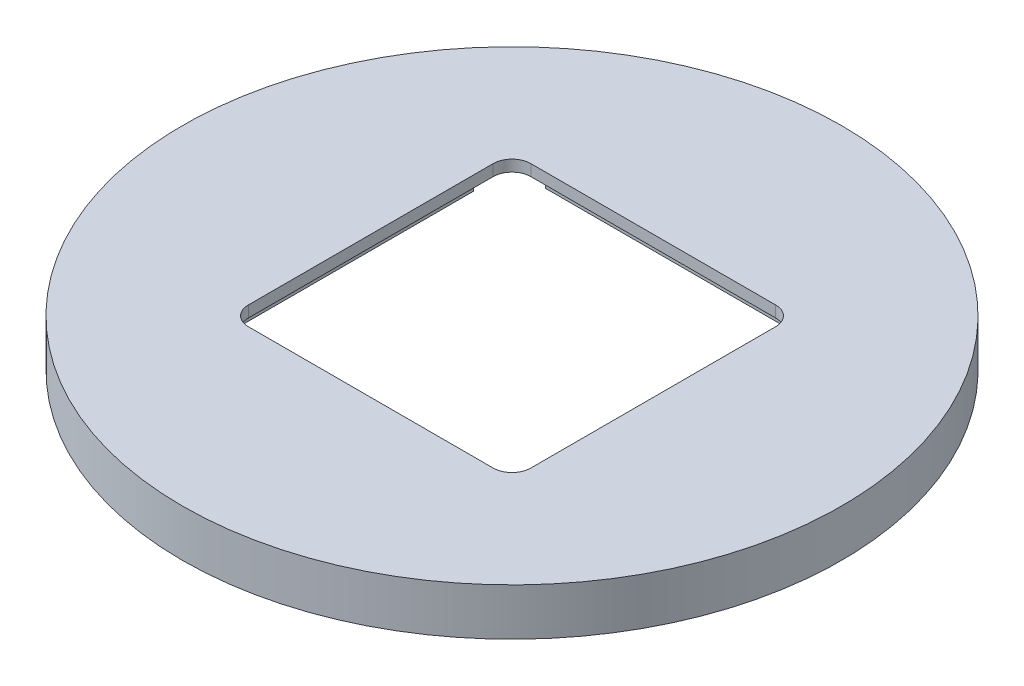
ISO-10303-21;
HEADER;
FILE_DESCRIPTION(('STEP AP214'),'2;1');
FILE_NAME('part.step','',(''),(''),'','','');
FILE_SCHEMA(('AUTOMOTIVE_DESIGN { 1 0 10303 214 1 1 1 1 }'));
ENDSEC;
DATA;
#1=APPLICATION_CONTEXT('core data for automotive mechanical design processes');
#2=APPLICATION_PROTOCOL_DEFINITION('international standard','automotive_design',2000,#1);
#3=PRODUCT_CONTEXT('',#1,'mechanical');
#4=PRODUCT('Part','Part','',(#3));
#5=PRODUCT_RELATED_PRODUCT_CATEGORY('part','',(#4));
#6=PRODUCT_DEFINITION_FORMATION('','',#4);
#7=PRODUCT_DEFINITION_CONTEXT('part definition',#1,'design');
#8=PRODUCT_DEFINITION('design','',#6,#7);
#9=PRODUCT_DEFINITION_SHAPE('','',#8);
#10=(LENGTH_UNIT() NAMED_UNIT(*) SI_UNIT(.MILLI.,.METRE.));
#11=(NAMED_UNIT(*) PLANE_ANGLE_UNIT() SI_UNIT($,.RADIAN.));
#12=(NAMED_UNIT(*) SI_UNIT($,.STERADIAN.) SOLID_ANGLE_UNIT());
#13=UNCERTAINTY_MEASURE_WITH_UNIT(LENGTH_MEASURE(1.E-05),#10,'distance_accuracy_value','');
#14=(GEOMETRIC_REPRESENTATION_CONTEXT(3) GLOBAL_UNCERTAINTY_ASSIGNED_CONTEXT((#13)) GLOBAL_UNIT_ASSIGNED_CONTEXT((#10,
#11,#12)) REPRESENTATION_CONTEXT('',''));
#15=CARTESIAN_POINT('',(0.,0.,0.));
#16=DIRECTION('',(0.,0.,1.));
#17=DIRECTION('',(1.,0.,0.));
#18=AXIS2_PLACEMENT_3D('',#15,#16,#17);
#19=CARTESIAN_POINT('',(-30.6337342069294,2.5,0.));
#20=DIRECTION('',(1.,0.,0.));
#21=DIRECTION('',(0.,0.,-1.));
#22=AXIS2_PLACEMENT_3D('',#19,#20,#21);
#23=PLANE('',#22);
#24=DIRECTION('',(0.,-1.,0.));
#25=VECTOR('',#24,1.);
#26=CARTESIAN_POINT('',(-30.6337342069294,6.14264068711931,-6.58297028172001));
#27=LINE('',#26,#25);
#28=CARTESIAN_POINT('',(-30.6337342069294,1.9,-6.58297028172001));
#29=VERTEX_POINT('',#28);
#30=CARTESIAN_POINT('',(-30.6337342069294,0.,-6.58297028172001));
#31=VERTEX_POINT('',#30);
#32=EDGE_CURVE('E52',#29,#31,#27,.T.);
#33=ORIENTED_EDGE('',*,*,#32,.F.);
#34=DIRECTION('',(0.,0.,-1.));
#35=VECTOR('',#34,1.);
#36=CARTESIAN_POINT('',(-30.6337342069294,1.9,0.));
#37=LINE('',#36,#35);
#38=CARTESIAN_POINT('',(-30.6337342069294,1.9,7.9571329264268));
#39=VERTEX_POINT('',#38);
#40=EDGE_CURVE('E257',#39,#29,#37,.T.);
#41=ORIENTED_EDGE('',*,*,#40,.F.);
#42=DIRECTION('',(0.,-1.,0.));
#43=VECTOR('',#42,1.);
#44=CARTESIAN_POINT('',(-30.6337342069294,6.14264068711931,7.9571329264268));
#45=LINE('',#44,#43);
#46=CARTESIAN_POINT('',(-30.6337342069294,0.,7.9571329264268));
#47=VERTEX_POINT('',#46);
#48=EDGE_CURVE('E249',#47,#39,#45,.F.);
#49=ORIENTED_EDGE('',*,*,#48,.F.);
#50=DIRECTION('',(0.,0.,1.));
#51=VECTOR('',#50,1.);
#52=CARTESIAN_POINT('',(-30.6337342069294,0.,0.));
#53=LINE('',#52,#51);
#54=EDGE_CURVE('E169',#31,#47,#53,.T.);
#55=ORIENTED_EDGE('',*,*,#54,.F.);
#56=EDGE_LOOP('',(#33,#41,#49,#55));
#57=FACE_BOUND('',#56,.T.);
#58=ADVANCED_FACE('F37',(#57),#23,.T.);
#59=CARTESIAN_POINT('',(0.,2.5,-8.6286535112001));
#60=DIRECTION('',(0.,0.,1.));
#61=DIRECTION('',(1.,0.,0.));
#62=AXIS2_PLACEMENT_3D('',#59,#60,#61);
#63=PLANE('',#62);
#64=DIRECTION('',(0.,-1.,0.));
#65=VECTOR('',#64,1.);
#66=CARTESIAN_POINT('',(-28.8589614984427,6.14264068711931,-8.62865351120009));
#67=LINE('',#66,#65);
#68=CARTESIAN_POINT('',(-28.8589614984427,0.,-8.62865351120009));
#69=VERTEX_POINT('',#68);
#70=CARTESIAN_POINT('',(-28.8589614984427,1.9,-8.62865351120009));
#71=VERTEX_POINT('',#70);
#72=EDGE_CURVE('E150',#69,#71,#67,.F.);
#73=ORIENTED_EDGE('',*,*,#72,.F.);
#74=DIRECTION('',(-1.,0.,0.));
#75=VECTOR('',#74,1.);
#76=CARTESIAN_POINT('',(0.,0.,-8.6286535112001));
#77=LINE('',#76,#75);
#78=CARTESIAN_POINT('',(-14.2479477693026,0.,-8.6286535112001));
#79=VERTEX_POINT('',#78);
#80=EDGE_CURVE('E161',#79,#69,#77,.T.);
#81=ORIENTED_EDGE('',*,*,#80,.F.);
#82=DIRECTION('',(0.,-1.,0.));
#83=VECTOR('',#82,1.);
#84=CARTESIAN_POINT('',(-14.2479477693026,6.14264068711931,-8.6286535112001));
#85=LINE('',#84,#83);
#86=CARTESIAN_POINT('',(-14.2479477693026,1.9,-8.6286535112001));
#87=VERTEX_POINT('',#86);
#88=EDGE_CURVE('E60',#87,#79,#85,.T.);
#89=ORIENTED_EDGE('',*,*,#88,.F.);
#90=DIRECTION('',(1.,0.,0.));
#91=VECTOR('',#90,1.);
#92=CARTESIAN_POINT('',(0.,1.9,-8.6286535112001));
#93=LINE('',#92,#91);
#94=EDGE_CURVE('E162',#71,#87,#93,.T.);
#95=ORIENTED_EDGE('',*,*,#94,.F.);
#96=EDGE_LOOP('',(#73,#81,#89,#95));
#97=FACE_BOUND('',#96,.T.);
#98=ADVANCED_FACE('F160',(#97),#63,.T.);
#99=CARTESIAN_POINT('',(-12.1337342069294,2.5,0.));
#100=DIRECTION('',(1.,0.,0.));
#101=DIRECTION('',(0.,0.,-1.));
#102=AXIS2_PLACEMENT_3D('',#99,#100,#101);
#103=PLANE('',#102);
#104=DIRECTION('',(0.,0.,1.));
#105=VECTOR('',#104,1.);
#106=CARTESIAN_POINT('',(-12.1337342069294,1.9,0.));
#107=LINE('',#106,#105);
#108=CARTESIAN_POINT('',(-12.1337342069294,1.9,-6.802003595058));
#109=VERTEX_POINT('',#108);
#110=CARTESIAN_POINT('',(-12.1337342069294,1.9,7.89657378031311));
#111=VERTEX_POINT('',#110);
#112=EDGE_CURVE('E262',#109,#111,#107,.T.);
#113=ORIENTED_EDGE('',*,*,#112,.F.);
#114=DIRECTION('',(0.,-1.,0.));
#115=VECTOR('',#114,1.);
#116=CARTESIAN_POINT('',(-12.1337342069294,6.14264068711931,-6.802003595058));
#117=LINE('',#116,#115);
#118=CARTESIAN_POINT('',(-12.1337342069294,0.,-6.802003595058));
#119=VERTEX_POINT('',#118);
#120=EDGE_CURVE('E584',#109,#119,#117,.T.);
#121=ORIENTED_EDGE('',*,*,#120,.T.);
#122=DIRECTION('',(0.,0.,1.));
#123=VECTOR('',#122,1.);
#124=CARTESIAN_POINT('',(-12.1337342069294,0.,0.));
#125=LINE('',#124,#123);
#126=CARTESIAN_POINT('',(-12.1337342069294,0.,7.89657378031311));
#127=VERTEX_POINT('',#126);
#128=EDGE_CURVE('E168',#119,#127,#125,.T.);
#129=ORIENTED_EDGE('',*,*,#128,.T.);
#130=DIRECTION('',(0.,-1.,0.));
#131=VECTOR('',#130,1.);
#132=CARTESIAN_POINT('',(-12.1337342069294,6.14264068711931,7.89657378031311));
#133=LINE('',#132,#131);
#134=EDGE_CURVE('E557',#127,#111,#133,.F.);
#135=ORIENTED_EDGE('',*,*,#134,.T.);
#136=EDGE_LOOP('',(#113,#121,#129,#135));
#137=FACE_BOUND('',#136,.T.);
#138=ADVANCED_FACE('F320',(#137),#103,.F.);
#139=CARTESIAN_POINT('',(0.,2.5,9.8713464887999));
#140=DIRECTION('',(0.,0.,1.));
#141=DIRECTION('',(1.,0.,0.));
#142=AXIS2_PLACEMENT_3D('',#139,#140,#141);
#143=PLANE('',#142);
#144=DIRECTION('',(-1.,0.,0.));
#145=VECTOR('',#144,1.);
#146=CARTESIAN_POINT('',(0.,1.9,9.8713464887999));
#147=LINE('',#146,#145);
#148=CARTESIAN_POINT('',(-14.1085069154162,1.9,9.8713464887999));
#149=VERTEX_POINT('',#148);
#150=CARTESIAN_POINT('',(-28.7195206445563,1.9,9.87134648879991));
#151=VERTEX_POINT('',#150);
#152=EDGE_CURVE('E260',#149,#151,#147,.T.);
#153=ORIENTED_EDGE('',*,*,#152,.F.);
#154=DIRECTION('',(0.,-1.,0.));
#155=VECTOR('',#154,1.);
#156=CARTESIAN_POINT('',(-14.1085069154162,6.14264068711931,9.8713464887999));
#157=LINE('',#156,#155);
#158=CARTESIAN_POINT('',(-14.1085069154162,0.,9.8713464887999));
#159=VERTEX_POINT('',#158);
#160=EDGE_CURVE('E554',#149,#159,#157,.T.);
#161=ORIENTED_EDGE('',*,*,#160,.T.);
#162=DIRECTION('',(-1.,0.,0.));
#163=VECTOR('',#162,1.);
#164=CARTESIAN_POINT('',(0.,0.,9.8713464887999));
#165=LINE('',#164,#163);
#166=CARTESIAN_POINT('',(-28.7195206445563,0.,9.87134648879991));
#167=VERTEX_POINT('',#166);
#168=EDGE_CURVE('E171',#159,#167,#165,.T.);
#169=ORIENTED_EDGE('',*,*,#168,.T.);
#170=DIRECTION('',(0.,-1.,0.));
#171=VECTOR('',#170,1.);
#172=CARTESIAN_POINT('',(-28.7195206445563,6.14264068711931,9.87134648879991));
#173=LINE('',#172,#171);
#174=EDGE_CURVE('E572',#167,#151,#173,.F.);
#175=ORIENTED_EDGE('',*,*,#174,.T.);
#176=EDGE_LOOP('',(#153,#161,#169,#175));
#177=FACE_BOUND('',#176,.T.);
#178=ADVANCED_FACE('F297',(#177),#143,.F.);
#179=CARTESIAN_POINT('',(-21.3837342069294,2.5,0.621346488799904));
#180=DIRECTION('',(0.,-1.,0.));
#181=DIRECTION('',(0.,0.,-1.));
#182=AXIS2_PLACEMENT_3D('',#179,#180,#181);
#183=CYLINDRICAL_SURFACE('',#182,17.5);
#184=CARTESIAN_POINT('',(-21.3837342069294,2.5,0.621346488799904));
#185=DIRECTION('',(0.,1.,0.));
#186=DIRECTION('',(0.,0.,1.));
#187=AXIS2_PLACEMENT_3D('',#184,#185,#186);
#188=CIRCLE('',#187,17.5);
#189=CARTESIAN_POINT('',(-21.3837342069294,2.5,18.1213464887999));
#190=VERTEX_POINT('',#189);
#191=EDGE_CURVE('E181',#190,#190,#188,.T.);
#192=ORIENTED_EDGE('',*,*,#191,.F.);
#193=EDGE_LOOP('',(#192));
#194=FACE_BOUND('',#193,.T.);
#195=CARTESIAN_POINT('',(-21.3837342069294,0.,0.621346488799904));
#196=DIRECTION('',(0.,1.,0.));
#197=DIRECTION('',(0.,0.,1.));
#198=AXIS2_PLACEMENT_3D('',#195,#196,#197);
#199=CIRCLE('',#198,17.5);
#200=CARTESIAN_POINT('',(-21.3837342069294,0.,18.1213464887999));
#201=VERTEX_POINT('',#200);
#202=EDGE_CURVE('E178',#201,#201,#199,.T.);
#203=ORIENTED_EDGE('',*,*,#202,.T.);
#204=EDGE_LOOP('',(#203));
#205=FACE_BOUND('',#204,.T.);
#206=ADVANCED_FACE('F294',(#194,#205),#183,.T.);
#207=CARTESIAN_POINT('',(0.,2.5,0.));
#208=DIRECTION('',(0.,1.,0.));
#209=DIRECTION('',(0.,0.,1.));
#210=AXIS2_PLACEMENT_3D('',#207,#208,#209);
#211=PLANE('',#210);
#212=ORIENTED_EDGE('',*,*,#191,.T.);
#213=EDGE_LOOP('',(#212));
#214=FACE_BOUND('',#213,.T.);
#215=DIRECTION('',(0.,0.,1.));
#216=VECTOR('',#215,1.);
#217=CARTESIAN_POINT('',(-28.8837342069294,2.5,0.));
#218=LINE('',#217,#216);
#219=CARTESIAN_POINT('',(-28.8837342069294,2.5,-5.87865351120009));
#220=VERTEX_POINT('',#219);
#221=CARTESIAN_POINT('',(-28.8837342069294,2.5,7.1213464887999));
#222=VERTEX_POINT('',#221);
#223=EDGE_CURVE('E220',#220,#222,#218,.T.);
#224=ORIENTED_EDGE('',*,*,#223,.F.);
#225=CARTESIAN_POINT('',(-27.8837342069294,2.5,-5.87865351120009));
#226=DIRECTION('',(0.,1.,0.));
#227=DIRECTION('',(0.,0.,1.));
#228=AXIS2_PLACEMENT_3D('',#225,#226,#227);
#229=CIRCLE('',#228,1.);
#230=CARTESIAN_POINT('',(-27.8837342069294,2.5,-6.87865351120009));
#231=VERTEX_POINT('',#230);
#232=EDGE_CURVE('E45',#220,#231,#229,.F.);
#233=ORIENTED_EDGE('',*,*,#232,.T.);
#234=DIRECTION('',(-1.,0.,0.));
#235=VECTOR('',#234,1.);
#236=CARTESIAN_POINT('',(0.,2.5,-6.8786535112001));
#237=LINE('',#236,#235);
#238=CARTESIAN_POINT('',(-14.8837342069294,2.5,-6.8786535112001));
#239=VERTEX_POINT('',#238);
#240=EDGE_CURVE('E218',#239,#231,#237,.T.);
#241=ORIENTED_EDGE('',*,*,#240,.F.);
#242=CARTESIAN_POINT('',(-14.8837342069294,2.5,-5.8786535112001));
#243=DIRECTION('',(0.,1.,0.));
#244=DIRECTION('',(0.,0.,1.));
#245=AXIS2_PLACEMENT_3D('',#242,#243,#244);
#246=CIRCLE('',#245,1.);
#247=CARTESIAN_POINT('',(-13.8837342069295,2.5,-5.8786535112001));
#248=VERTEX_POINT('',#247);
#249=EDGE_CURVE('E210',#239,#248,#246,.F.);
#250=ORIENTED_EDGE('',*,*,#249,.T.);
#251=DIRECTION('',(0.,0.,1.));
#252=VECTOR('',#251,1.);
#253=CARTESIAN_POINT('',(-13.8837342069295,2.5,0.));
#254=LINE('',#253,#252);
#255=CARTESIAN_POINT('',(-13.8837342069295,2.5,7.1213464887999));
#256=VERTEX_POINT('',#255);
#257=EDGE_CURVE('E229',#248,#256,#254,.T.);
#258=ORIENTED_EDGE('',*,*,#257,.T.);
#259=CARTESIAN_POINT('',(-14.8837342069294,2.5,7.1213464887999));
#260=DIRECTION('',(0.,1.,0.));
#261=DIRECTION('',(0.,0.,1.));
#262=AXIS2_PLACEMENT_3D('',#259,#260,#261);
#263=CIRCLE('',#262,1.);
#264=CARTESIAN_POINT('',(-14.8837342069294,2.5,8.1213464887999));
#265=VERTEX_POINT('',#264);
#266=EDGE_CURVE('E206',#256,#265,#263,.F.);
#267=ORIENTED_EDGE('',*,*,#266,.T.);
#268=DIRECTION('',(-1.,0.,0.));
#269=VECTOR('',#268,1.);
#270=CARTESIAN_POINT('',(0.,2.5,8.1213464887999));
#271=LINE('',#270,#269);
#272=CARTESIAN_POINT('',(-27.8837342069294,2.5,8.1213464887999));
#273=VERTEX_POINT('',#272);
#274=EDGE_CURVE('E242',#265,#273,#271,.T.);
#275=ORIENTED_EDGE('',*,*,#274,.T.);
#276=CARTESIAN_POINT('',(-27.8837342069294,2.5,7.1213464887999));
#277=DIRECTION('',(0.,1.,0.));
#278=DIRECTION('',(0.,0.,1.));
#279=AXIS2_PLACEMENT_3D('',#276,#277,#278);
#280=CIRCLE('',#279,1.);
#281=EDGE_CURVE('E202',#273,#222,#280,.F.);
#282=ORIENTED_EDGE('',*,*,#281,.T.);
#283=EDGE_LOOP('',(#224,#233,#241,#250,#258,#267,#275,#282));
#284=FACE_BOUND('',#283,.T.);
#285=ADVANCED_FACE('F217',(#214,#284),#211,.T.);
#286=CARTESIAN_POINT('',(0.,0.,0.));
#287=DIRECTION('',(0.,1.,0.));
#288=DIRECTION('',(0.,0.,1.));
#289=AXIS2_PLACEMENT_3D('',#286,#287,#288);
#290=PLANE('',#289);
#291=CARTESIAN_POINT('',(-36.352036057223,0.,0.435404850908226));
#292=DIRECTION('',(0.,-1.,0.));
#293=DIRECTION('',(1.,0.,0.));
#294=AXIS2_PLACEMENT_3D('',#291,#292,#293);
#295=CIRCLE('',#294,1.67);
#296=CARTESIAN_POINT('',(-34.682036057223,0.,0.435404850908209));
#297=VERTEX_POINT('',#296);
#298=EDGE_CURVE('E265',#297,#297,#295,.T.);
#299=ORIENTED_EDGE('',*,*,#298,.F.);
#300=EDGE_LOOP('',(#299));
#301=FACE_BOUND('',#300,.T.);
#302=CARTESIAN_POINT('',(-21.1977925690376,0.,-14.3469553614937));
#303=DIRECTION('',(0.,-1.,0.));
#304=DIRECTION('',(0.,0.,1.));
#305=AXIS2_PLACEMENT_3D('',#302,#303,#304);
#306=CIRCLE('',#305,1.67);
#307=CARTESIAN_POINT('',(-21.1977925690376,0.,-12.6769553614937));
#308=VERTEX_POINT('',#307);
#309=EDGE_CURVE('E272',#308,#308,#306,.T.);
#310=ORIENTED_EDGE('',*,*,#309,.F.);
#311=EDGE_LOOP('',(#310));
#312=FACE_BOUND('',#311,.T.);
#313=CARTESIAN_POINT('',(-6.41543235663587,0.,0.807288126691688));
#314=DIRECTION('',(0.,-1.,0.));
#315=DIRECTION('',(-1.,0.,0.));
#316=AXIS2_PLACEMENT_3D('',#313,#314,#315);
#317=CIRCLE('',#316,1.67);
#318=CARTESIAN_POINT('',(-8.08543235663587,0.,0.807288126691694));
#319=VERTEX_POINT('',#318);
#320=EDGE_CURVE('E278',#319,#319,#317,.T.);
#321=ORIENTED_EDGE('',*,*,#320,.F.);
#322=EDGE_LOOP('',(#321));
#323=FACE_BOUND('',#322,.T.);
#324=CARTESIAN_POINT('',(-21.5696758448213,0.,15.5896483390935));
#325=DIRECTION('',(0.,-1.,0.));
#326=DIRECTION('',(0.,0.,-1.));
#327=AXIS2_PLACEMENT_3D('',#324,#325,#326);
#328=CIRCLE('',#327,1.67);
#329=CARTESIAN_POINT('',(-21.5696758448213,0.,13.9196483390935));
#330=VERTEX_POINT('',#329);
#331=EDGE_CURVE('E284',#330,#330,#328,.T.);
#332=ORIENTED_EDGE('',*,*,#331,.F.);
#333=EDGE_LOOP('',(#332));
#334=FACE_BOUND('',#333,.T.);
#335=ORIENTED_EDGE('',*,*,#80,.T.);
#336=CARTESIAN_POINT('',(-30.2337342069295,0.,-8.02865351120012));
#337=DIRECTION('',(0.,-1.,0.));
#338=DIRECTION('',(0.,0.,-1.));
#339=AXIS2_PLACEMENT_3D('',#336,#337,#338);
#340=CIRCLE('',#339,1.50000000000001);
#341=EDGE_CURVE('E147',#31,#69,#340,.T.);
#342=ORIENTED_EDGE('',*,*,#341,.F.);
#343=ORIENTED_EDGE('',*,*,#54,.T.);
#344=CARTESIAN_POINT('',(-30.1337342069294,0.,9.3713464887999));
#345=DIRECTION('',(0.,-1.,0.));
#346=DIRECTION('',(0.,0.,-1.));
#347=AXIS2_PLACEMENT_3D('',#344,#345,#346);
#348=CIRCLE('',#347,1.5);
#349=EDGE_CURVE('E567',#167,#47,#348,.T.);
#350=ORIENTED_EDGE('',*,*,#349,.F.);
#351=ORIENTED_EDGE('',*,*,#168,.F.);
#352=CARTESIAN_POINT('',(-12.7337342069294,0.,9.27134648879987));
#353=DIRECTION('',(0.,-1.,0.));
#354=DIRECTION('',(0.,0.,-1.));
#355=AXIS2_PLACEMENT_3D('',#352,#353,#354);
#356=CIRCLE('',#355,1.5);
#357=EDGE_CURVE('E551',#127,#159,#356,.T.);
#358=ORIENTED_EDGE('',*,*,#357,.F.);
#359=ORIENTED_EDGE('',*,*,#128,.F.);
#360=CARTESIAN_POINT('',(-12.8337342069294,0.,-8.12865351120015));
#361=DIRECTION('',(0.,-1.,0.));
#362=DIRECTION('',(0.,0.,-1.));
#363=AXIS2_PLACEMENT_3D('',#360,#361,#362);
#364=CIRCLE('',#363,1.5);
#365=EDGE_CURVE('E167',#79,#119,#364,.T.);
#366=ORIENTED_EDGE('',*,*,#365,.F.);
#367=EDGE_LOOP('',(#335,#342,#343,#350,#351,#358,#359,#366));
#368=FACE_BOUND('',#367,.T.);
#369=ORIENTED_EDGE('',*,*,#202,.F.);
#370=EDGE_LOOP('',(#369));
#371=FACE_BOUND('',#370,.T.);
#372=ADVANCED_FACE('F164',(#301,#312,#323,#334,#368,#371),#290,.F.);
#373=CARTESIAN_POINT('',(-21.5696758448213,1.15,15.5896483390935));
#374=DIRECTION('',(0.,-1.,0.));
#375=DIRECTION('',(0.,0.,-1.));
#376=AXIS2_PLACEMENT_3D('',#373,#374,#375);
#377=CYLINDRICAL_SURFACE('',#376,1.67);
#378=CARTESIAN_POINT('',(-21.5696758448213,1.15,15.5896483390935));
#379=DIRECTION('',(0.,-1.,0.));
#380=DIRECTION('',(0.,0.,-1.));
#381=AXIS2_PLACEMENT_3D('',#378,#379,#380);
#382=CIRCLE('',#381,1.67);
#383=CARTESIAN_POINT('',(-21.5696758448213,1.15,13.9196483390935));
#384=VERTEX_POINT('',#383);
#385=EDGE_CURVE('E173',#384,#384,#382,.T.);
#386=ORIENTED_EDGE('',*,*,#385,.F.);
#387=EDGE_LOOP('',(#386));
#388=FACE_BOUND('',#387,.T.);
#389=ORIENTED_EDGE('',*,*,#331,.T.);
#390=EDGE_LOOP('',(#389));
#391=FACE_BOUND('',#390,.T.);
#392=ADVANCED_FACE('F301',(#388,#391),#377,.F.);
#393=CARTESIAN_POINT('',(-21.5696758448213,1.15,15.5896483390935));
#394=DIRECTION('',(0.,-1.,0.));
#395=DIRECTION('',(0.,0.,-1.));
#396=AXIS2_PLACEMENT_3D('',#393,#394,#395);
#397=PLANE('',#396);
#398=ORIENTED_EDGE('',*,*,#385,.T.);
#399=EDGE_LOOP('',(#398));
#400=FACE_BOUND('',#399,.T.);
#401=ADVANCED_FACE('F308',(#400),#397,.T.);
#402=CARTESIAN_POINT('',(-6.41543235663587,1.15,0.807288126691688));
#403=DIRECTION('',(0.,-1.,0.));
#404=DIRECTION('',(0.,0.,-1.));
#405=AXIS2_PLACEMENT_3D('',#402,#403,#404);
#406=CYLINDRICAL_SURFACE('',#405,1.67);
#407=CARTESIAN_POINT('',(-6.41543235663587,1.15,0.807288126691688));
#408=DIRECTION('',(0.,-1.,0.));
#409=DIRECTION('',(-1.,0.,0.));
#410=AXIS2_PLACEMENT_3D('',#407,#408,#409);
#411=CIRCLE('',#410,1.67);
#412=CARTESIAN_POINT('',(-8.08543235663587,1.15,0.807288126691694));
#413=VERTEX_POINT('',#412);
#414=EDGE_CURVE('E281',#413,#413,#411,.T.);
#415=ORIENTED_EDGE('',*,*,#414,.F.);
#416=EDGE_LOOP('',(#415));
#417=FACE_BOUND('',#416,.T.);
#418=ORIENTED_EDGE('',*,*,#320,.T.);
#419=EDGE_LOOP('',(#418));
#420=FACE_BOUND('',#419,.T.);
#421=ADVANCED_FACE('F384',(#417,#420),#406,.F.);
#422=CARTESIAN_POINT('',(-6.41543235663587,1.15,0.807288126691688));
#423=DIRECTION('',(0.,-1.,0.));
#424=DIRECTION('',(-1.,0.,0.));
#425=AXIS2_PLACEMENT_3D('',#422,#423,#424);
#426=PLANE('',#425);
#427=ORIENTED_EDGE('',*,*,#414,.T.);
#428=EDGE_LOOP('',(#427));
#429=FACE_BOUND('',#428,.T.);
#430=ADVANCED_FACE('F380',(#429),#426,.T.);
#431=CARTESIAN_POINT('',(-21.1977925690376,1.15,-14.3469553614937));
#432=DIRECTION('',(0.,-1.,0.));
#433=DIRECTION('',(0.,0.,-1.));
#434=AXIS2_PLACEMENT_3D('',#431,#432,#433);
#435=CYLINDRICAL_SURFACE('',#434,1.67);
#436=CARTESIAN_POINT('',(-21.1977925690376,1.15,-14.3469553614937));
#437=DIRECTION('',(0.,-1.,0.));
#438=DIRECTION('',(0.,0.,1.));
#439=AXIS2_PLACEMENT_3D('',#436,#437,#438);
#440=CIRCLE('',#439,1.67);
#441=CARTESIAN_POINT('',(-21.1977925690376,1.15,-12.6769553614937));
#442=VERTEX_POINT('',#441);
#443=EDGE_CURVE('E275',#442,#442,#440,.T.);
#444=ORIENTED_EDGE('',*,*,#443,.F.);
#445=EDGE_LOOP('',(#444));
#446=FACE_BOUND('',#445,.T.);
#447=ORIENTED_EDGE('',*,*,#309,.T.);
#448=EDGE_LOOP('',(#447));
#449=FACE_BOUND('',#448,.T.);
#450=ADVANCED_FACE('F376',(#446,#449),#435,.F.);
#451=CARTESIAN_POINT('',(-21.1977925690376,1.15,-14.3469553614937));
#452=DIRECTION('',(0.,-1.,0.));
#453=DIRECTION('',(0.,0.,1.));
#454=AXIS2_PLACEMENT_3D('',#451,#452,#453);
#455=PLANE('',#454);
#456=ORIENTED_EDGE('',*,*,#443,.T.);
#457=EDGE_LOOP('',(#456));
#458=FACE_BOUND('',#457,.T.);
#459=ADVANCED_FACE('F372',(#458),#455,.T.);
#460=CARTESIAN_POINT('',(-36.352036057223,1.15,0.435404850908226));
#461=DIRECTION('',(0.,-1.,0.));
#462=DIRECTION('',(0.,0.,-1.));
#463=AXIS2_PLACEMENT_3D('',#460,#461,#462);
#464=CYLINDRICAL_SURFACE('',#463,1.67);
#465=CARTESIAN_POINT('',(-36.352036057223,1.15,0.435404850908226));
#466=DIRECTION('',(0.,-1.,0.));
#467=DIRECTION('',(1.,0.,0.));
#468=AXIS2_PLACEMENT_3D('',#465,#466,#467);
#469=CIRCLE('',#468,1.67);
#470=CARTESIAN_POINT('',(-34.682036057223,1.15,0.435404850908209));
#471=VERTEX_POINT('',#470);
#472=EDGE_CURVE('E269',#471,#471,#469,.T.);
#473=ORIENTED_EDGE('',*,*,#472,.F.);
#474=EDGE_LOOP('',(#473));
#475=FACE_BOUND('',#474,.T.);
#476=ORIENTED_EDGE('',*,*,#298,.T.);
#477=EDGE_LOOP('',(#476));
#478=FACE_BOUND('',#477,.T.);
#479=ADVANCED_FACE('F368',(#475,#478),#464,.F.);
#480=CARTESIAN_POINT('',(-36.352036057223,1.15,0.435404850908226));
#481=DIRECTION('',(0.,-1.,0.));
#482=DIRECTION('',(1.,0.,0.));
#483=AXIS2_PLACEMENT_3D('',#480,#481,#482);
#484=PLANE('',#483);
#485=ORIENTED_EDGE('',*,*,#472,.T.);
#486=EDGE_LOOP('',(#485));
#487=FACE_BOUND('',#486,.T.);
#488=ADVANCED_FACE('F359',(#487),#484,.T.);
#489=CARTESIAN_POINT('',(-28.8837342069294,1.9,0.));
#490=DIRECTION('',(-1.,0.,0.));
#491=DIRECTION('',(0.,0.,1.));
#492=AXIS2_PLACEMENT_3D('',#489,#490,#491);
#493=PLANE('',#492);
#494=ORIENTED_EDGE('',*,*,#223,.T.);
#495=DIRECTION('',(0.,1.,0.));
#496=VECTOR('',#495,1.);
#497=CARTESIAN_POINT('',(-28.8837342069294,1.9,7.1213464887999));
#498=LINE('',#497,#496);
#499=CARTESIAN_POINT('',(-28.8837342069294,1.9,7.1213464887999));
#500=VERTEX_POINT('',#499);
#501=EDGE_CURVE('E190',#222,#500,#498,.F.);
#502=ORIENTED_EDGE('',*,*,#501,.T.);
#503=DIRECTION('',(0.,0.,1.));
#504=VECTOR('',#503,1.);
#505=CARTESIAN_POINT('',(-28.8837342069294,1.9,0.));
#506=LINE('',#505,#504);
#507=CARTESIAN_POINT('',(-28.8837342069294,1.9,-5.87865351120009));
#508=VERTEX_POINT('',#507);
#509=EDGE_CURVE('E236',#508,#500,#506,.T.);
#510=ORIENTED_EDGE('',*,*,#509,.F.);
#511=DIRECTION('',(0.,1.,0.));
#512=VECTOR('',#511,1.);
#513=CARTESIAN_POINT('',(-28.8837342069294,2.5,-5.87865351120009));
#514=LINE('',#513,#512);
#515=EDGE_CURVE('E187',#508,#220,#514,.T.);
#516=ORIENTED_EDGE('',*,*,#515,.T.);
#517=EDGE_LOOP('',(#494,#502,#510,#516));
#518=FACE_BOUND('',#517,.T.);
#519=ADVANCED_FACE('F240',(#518),#493,.F.);
#520=CARTESIAN_POINT('',(0.,1.9,8.1213464887999));
#521=DIRECTION('',(0.,0.,-1.));
#522=DIRECTION('',(-1.,0.,0.));
#523=AXIS2_PLACEMENT_3D('',#520,#521,#522);
#524=PLANE('',#523);
#525=DIRECTION('',(-1.,0.,0.));
#526=VECTOR('',#525,1.);
#527=CARTESIAN_POINT('',(0.,1.9,8.1213464887999));
#528=LINE('',#527,#526);
#529=CARTESIAN_POINT('',(-14.8837342069294,1.9,8.1213464887999));
#530=VERTEX_POINT('',#529);
#531=CARTESIAN_POINT('',(-27.8837342069294,1.9,8.1213464887999));
#532=VERTEX_POINT('',#531);
#533=EDGE_CURVE('E254',#530,#532,#528,.T.);
#534=ORIENTED_EDGE('',*,*,#533,.T.);
#535=DIRECTION('',(0.,1.,0.));
#536=VECTOR('',#535,1.);
#537=CARTESIAN_POINT('',(-27.8837342069294,1.9,8.1213464887999));
#538=LINE('',#537,#536);
#539=EDGE_CURVE('E184',#532,#273,#538,.T.);
#540=ORIENTED_EDGE('',*,*,#539,.T.);
#541=ORIENTED_EDGE('',*,*,#274,.F.);
#542=DIRECTION('',(0.,1.,0.));
#543=VECTOR('',#542,1.);
#544=CARTESIAN_POINT('',(-14.8837342069294,1.9,8.1213464887999));
#545=LINE('',#544,#543);
#546=EDGE_CURVE('E182',#265,#530,#545,.F.);
#547=ORIENTED_EDGE('',*,*,#546,.T.);
#548=EDGE_LOOP('',(#534,#540,#541,#547));
#549=FACE_BOUND('',#548,.T.);
#550=ADVANCED_FACE('F350',(#549),#524,.T.);
#551=CARTESIAN_POINT('',(-13.8837342069295,1.9,0.));
#552=DIRECTION('',(-1.,0.,0.));
#553=DIRECTION('',(0.,0.,1.));
#554=AXIS2_PLACEMENT_3D('',#551,#552,#553);
#555=PLANE('',#554);
#556=DIRECTION('',(0.,0.,1.));
#557=VECTOR('',#556,1.);
#558=CARTESIAN_POINT('',(-13.8837342069295,1.9,0.));
#559=LINE('',#558,#557);
#560=CARTESIAN_POINT('',(-13.8837342069295,1.9,-5.8786535112001));
#561=VERTEX_POINT('',#560);
#562=CARTESIAN_POINT('',(-13.8837342069295,1.9,7.1213464887999));
#563=VERTEX_POINT('',#562);
#564=EDGE_CURVE('E244',#561,#563,#559,.T.);
#565=ORIENTED_EDGE('',*,*,#564,.T.);
#566=DIRECTION('',(0.,1.,0.));
#567=VECTOR('',#566,1.);
#568=CARTESIAN_POINT('',(-13.8837342069295,2.5,7.1213464887999));
#569=LINE('',#568,#567);
#570=EDGE_CURVE('E194',#563,#256,#569,.T.);
#571=ORIENTED_EDGE('',*,*,#570,.T.);
#572=ORIENTED_EDGE('',*,*,#257,.F.);
#573=DIRECTION('',(0.,1.,0.));
#574=VECTOR('',#573,1.);
#575=CARTESIAN_POINT('',(-13.8837342069295,1.9,-5.8786535112001));
#576=LINE('',#575,#574);
#577=EDGE_CURVE('E192',#248,#561,#576,.F.);
#578=ORIENTED_EDGE('',*,*,#577,.T.);
#579=EDGE_LOOP('',(#565,#571,#572,#578));
#580=FACE_BOUND('',#579,.T.);
#581=ADVANCED_FACE('F345',(#580),#555,.T.);
#582=CARTESIAN_POINT('',(0.,1.9,-6.8786535112001));
#583=DIRECTION('',(0.,0.,-1.));
#584=DIRECTION('',(-1.,0.,0.));
#585=AXIS2_PLACEMENT_3D('',#582,#583,#584);
#586=PLANE('',#585);
#587=DIRECTION('',(-1.,0.,0.));
#588=VECTOR('',#587,1.);
#589=CARTESIAN_POINT('',(0.,1.9,-6.8786535112001));
#590=LINE('',#589,#588);
#591=CARTESIAN_POINT('',(-14.8837342069294,1.9,-6.8786535112001));
#592=VERTEX_POINT('',#591);
#593=CARTESIAN_POINT('',(-27.8837342069294,1.9,-6.87865351120009));
#594=VERTEX_POINT('',#593);
#595=EDGE_CURVE('E238',#592,#594,#590,.T.);
#596=ORIENTED_EDGE('',*,*,#595,.F.);
#597=DIRECTION('',(0.,1.,0.));
#598=VECTOR('',#597,1.);
#599=CARTESIAN_POINT('',(-14.8837342069294,1.9,-6.8786535112001));
#600=LINE('',#599,#598);
#601=EDGE_CURVE('E199',#592,#239,#600,.T.);
#602=ORIENTED_EDGE('',*,*,#601,.T.);
#603=ORIENTED_EDGE('',*,*,#240,.T.);
#604=DIRECTION('',(0.,1.,0.));
#605=VECTOR('',#604,1.);
#606=CARTESIAN_POINT('',(-27.8837342069294,1.9,-6.87865351120009));
#607=LINE('',#606,#605);
#608=EDGE_CURVE('E197',#231,#594,#607,.F.);
#609=ORIENTED_EDGE('',*,*,#608,.T.);
#610=EDGE_LOOP('',(#596,#602,#603,#609));
#611=FACE_BOUND('',#610,.T.);
#612=ADVANCED_FACE('F226',(#611),#586,.F.);
#613=CARTESIAN_POINT('',(0.,1.9,0.));
#614=DIRECTION('',(0.,1.,0.));
#615=DIRECTION('',(0.,0.,1.));
#616=AXIS2_PLACEMENT_3D('',#613,#614,#615);
#617=PLANE('',#616);
#618=ORIENTED_EDGE('',*,*,#40,.T.);
#619=CARTESIAN_POINT('',(-30.2337342069295,1.9,-8.02865351120012));
#620=DIRECTION('',(0.,1.,0.));
#621=DIRECTION('',(0.,0.,1.));
#622=AXIS2_PLACEMENT_3D('',#619,#620,#621);
#623=CIRCLE('',#622,1.50000000000001);
#624=EDGE_CURVE('E155',#29,#71,#623,.F.);
#625=ORIENTED_EDGE('',*,*,#624,.T.);
#626=ORIENTED_EDGE('',*,*,#94,.T.);
#627=CARTESIAN_POINT('',(-12.8337342069294,1.9,-8.12865351120015));
#628=DIRECTION('',(0.,1.,0.));
#629=DIRECTION('',(0.,0.,1.));
#630=AXIS2_PLACEMENT_3D('',#627,#628,#629);
#631=CIRCLE('',#630,1.5);
#632=EDGE_CURVE('E578',#87,#109,#631,.F.);
#633=ORIENTED_EDGE('',*,*,#632,.T.);
#634=ORIENTED_EDGE('',*,*,#112,.T.);
#635=CARTESIAN_POINT('',(-12.7337342069294,1.9,9.27134648879987));
#636=DIRECTION('',(0.,1.,0.));
#637=DIRECTION('',(0.,0.,1.));
#638=AXIS2_PLACEMENT_3D('',#635,#636,#637);
#639=CIRCLE('',#638,1.5);
#640=EDGE_CURVE('E559',#111,#149,#639,.F.);
#641=ORIENTED_EDGE('',*,*,#640,.T.);
#642=ORIENTED_EDGE('',*,*,#152,.T.);
#643=CARTESIAN_POINT('',(-30.1337342069294,1.9,9.3713464887999));
#644=DIRECTION('',(0.,1.,0.));
#645=DIRECTION('',(0.,0.,1.));
#646=AXIS2_PLACEMENT_3D('',#643,#644,#645);
#647=CIRCLE('',#646,1.5);
#648=EDGE_CURVE('E569',#151,#39,#647,.F.);
#649=ORIENTED_EDGE('',*,*,#648,.T.);
#650=EDGE_LOOP('',(#618,#625,#626,#633,#634,#641,#642,#649));
#651=FACE_BOUND('',#650,.T.);
#652=ORIENTED_EDGE('',*,*,#595,.T.);
#653=CARTESIAN_POINT('',(-27.8837342069294,1.9,-5.87865351120009));
#654=DIRECTION('',(0.,1.,0.));
#655=DIRECTION('',(0.,0.,1.));
#656=AXIS2_PLACEMENT_3D('',#653,#654,#655);
#657=CIRCLE('',#656,1.);
#658=EDGE_CURVE('E11',#594,#508,#657,.T.);
#659=ORIENTED_EDGE('',*,*,#658,.T.);
#660=ORIENTED_EDGE('',*,*,#509,.T.);
#661=CARTESIAN_POINT('',(-27.8837342069294,1.9,7.1213464887999));
#662=DIRECTION('',(0.,1.,0.));
#663=DIRECTION('',(0.,0.,1.));
#664=AXIS2_PLACEMENT_3D('',#661,#662,#663);
#665=CIRCLE('',#664,1.);
#666=EDGE_CURVE('E204',#500,#532,#665,.T.);
#667=ORIENTED_EDGE('',*,*,#666,.T.);
#668=ORIENTED_EDGE('',*,*,#533,.F.);
#669=CARTESIAN_POINT('',(-14.8837342069294,1.9,7.1213464887999));
#670=DIRECTION('',(0.,1.,0.));
#671=DIRECTION('',(0.,0.,1.));
#672=AXIS2_PLACEMENT_3D('',#669,#670,#671);
#673=CIRCLE('',#672,1.);
#674=EDGE_CURVE('E208',#530,#563,#673,.T.);
#675=ORIENTED_EDGE('',*,*,#674,.T.);
#676=ORIENTED_EDGE('',*,*,#564,.F.);
#677=CARTESIAN_POINT('',(-14.8837342069294,1.9,-5.8786535112001));
#678=DIRECTION('',(0.,1.,0.));
#679=DIRECTION('',(0.,0.,1.));
#680=AXIS2_PLACEMENT_3D('',#677,#678,#679);
#681=CIRCLE('',#680,1.);
#682=EDGE_CURVE('E212',#561,#592,#681,.T.);
#683=ORIENTED_EDGE('',*,*,#682,.T.);
#684=EDGE_LOOP('',(#652,#659,#660,#667,#668,#675,#676,#683));
#685=FACE_BOUND('',#684,.T.);
#686=ADVANCED_FACE('F235',(#651,#685),#617,.F.);
#687=CARTESIAN_POINT('',(-27.8837342069294,1.9,7.1213464887999));
#688=DIRECTION('',(0.,1.,0.));
#689=DIRECTION('',(0.,0.,1.));
#690=AXIS2_PLACEMENT_3D('',#687,#688,#689);
#691=CYLINDRICAL_SURFACE('',#690,1.);
#692=ORIENTED_EDGE('',*,*,#666,.F.);
#693=ORIENTED_EDGE('',*,*,#501,.F.);
#694=ORIENTED_EDGE('',*,*,#281,.F.);
#695=ORIENTED_EDGE('',*,*,#539,.F.);
#696=EDGE_LOOP('',(#692,#693,#694,#695));
#697=FACE_BOUND('',#696,.T.);
#698=ADVANCED_FACE('F324',(#697),#691,.F.);
#699=CARTESIAN_POINT('',(-14.8837342069294,1.9,7.1213464887999));
#700=DIRECTION('',(0.,-1.,0.));
#701=DIRECTION('',(0.,0.,-1.));
#702=AXIS2_PLACEMENT_3D('',#699,#700,#701);
#703=CYLINDRICAL_SURFACE('',#702,1.);
#704=ORIENTED_EDGE('',*,*,#674,.F.);
#705=ORIENTED_EDGE('',*,*,#546,.F.);
#706=ORIENTED_EDGE('',*,*,#266,.F.);
#707=ORIENTED_EDGE('',*,*,#570,.F.);
#708=EDGE_LOOP('',(#704,#705,#706,#707));
#709=FACE_BOUND('',#708,.T.);
#710=ADVANCED_FACE('F327',(#709),#703,.F.);
#711=CARTESIAN_POINT('',(-14.8837342069294,1.9,-5.8786535112001));
#712=DIRECTION('',(0.,1.,0.));
#713=DIRECTION('',(0.,0.,1.));
#714=AXIS2_PLACEMENT_3D('',#711,#712,#713);
#715=CYLINDRICAL_SURFACE('',#714,1.);
#716=ORIENTED_EDGE('',*,*,#682,.F.);
#717=ORIENTED_EDGE('',*,*,#577,.F.);
#718=ORIENTED_EDGE('',*,*,#249,.F.);
#719=ORIENTED_EDGE('',*,*,#601,.F.);
#720=EDGE_LOOP('',(#716,#717,#718,#719));
#721=FACE_BOUND('',#720,.T.);
#722=ADVANCED_FACE('F330',(#721),#715,.F.);
#723=CARTESIAN_POINT('',(-27.8837342069294,1.9,-5.87865351120009));
#724=DIRECTION('',(0.,-1.,0.));
#725=DIRECTION('',(0.,0.,-1.));
#726=AXIS2_PLACEMENT_3D('',#723,#724,#725);
#727=CYLINDRICAL_SURFACE('',#726,1.);
#728=ORIENTED_EDGE('',*,*,#658,.F.);
#729=ORIENTED_EDGE('',*,*,#608,.F.);
#730=ORIENTED_EDGE('',*,*,#232,.F.);
#731=ORIENTED_EDGE('',*,*,#515,.F.);
#732=EDGE_LOOP('',(#728,#729,#730,#731));
#733=FACE_BOUND('',#732,.T.);
#734=ADVANCED_FACE('F39',(#733),#727,.F.);
#735=CARTESIAN_POINT('',(-30.1337342069294,6.14264068711931,9.3713464887999));
#736=DIRECTION('',(0.,-1.,0.));
#737=DIRECTION('',(0.,0.,-1.));
#738=AXIS2_PLACEMENT_3D('',#735,#736,#737);
#739=CYLINDRICAL_SURFACE('',#738,1.5);
#740=ORIENTED_EDGE('',*,*,#48,.T.);
#741=ORIENTED_EDGE('',*,*,#648,.F.);
#742=ORIENTED_EDGE('',*,*,#174,.F.);
#743=ORIENTED_EDGE('',*,*,#349,.T.);
#744=EDGE_LOOP('',(#740,#741,#742,#743));
#745=FACE_BOUND('',#744,.T.);
#746=ADVANCED_FACE('F337',(#745),#739,.F.);
#747=CARTESIAN_POINT('',(-12.7337342069294,6.14264068711931,9.27134648879987));
#748=DIRECTION('',(0.,-1.,0.));
#749=DIRECTION('',(0.,0.,-1.));
#750=AXIS2_PLACEMENT_3D('',#747,#748,#749);
#751=CYLINDRICAL_SURFACE('',#750,1.5);
#752=ORIENTED_EDGE('',*,*,#357,.T.);
#753=ORIENTED_EDGE('',*,*,#160,.F.);
#754=ORIENTED_EDGE('',*,*,#640,.F.);
#755=ORIENTED_EDGE('',*,*,#134,.F.);
#756=EDGE_LOOP('',(#752,#753,#754,#755));
#757=FACE_BOUND('',#756,.T.);
#758=ADVANCED_FACE('F519',(#757),#751,.F.);
#759=CARTESIAN_POINT('',(-12.8337342069294,6.14264068711931,-8.12865351120015));
#760=DIRECTION('',(0.,-1.,0.));
#761=DIRECTION('',(0.,0.,-1.));
#762=AXIS2_PLACEMENT_3D('',#759,#760,#761);
#763=CYLINDRICAL_SURFACE('',#762,1.5);
#764=ORIENTED_EDGE('',*,*,#88,.T.);
#765=ORIENTED_EDGE('',*,*,#365,.T.);
#766=ORIENTED_EDGE('',*,*,#120,.F.);
#767=ORIENTED_EDGE('',*,*,#632,.F.);
#768=EDGE_LOOP('',(#764,#765,#766,#767));
#769=FACE_BOUND('',#768,.T.);
#770=ADVANCED_FACE('F528',(#769),#763,.F.);
#771=CARTESIAN_POINT('',(-30.2337342069295,6.14264068711931,-8.02865351120012));
#772=DIRECTION('',(0.,-1.,0.));
#773=DIRECTION('',(0.,0.,-1.));
#774=AXIS2_PLACEMENT_3D('',#771,#772,#773);
#775=CYLINDRICAL_SURFACE('',#774,1.50000000000001);
#776=ORIENTED_EDGE('',*,*,#32,.T.);
#777=ORIENTED_EDGE('',*,*,#341,.T.);
#778=ORIENTED_EDGE('',*,*,#72,.T.);
#779=ORIENTED_EDGE('',*,*,#624,.F.);
#780=EDGE_LOOP('',(#776,#777,#778,#779));
#781=FACE_BOUND('',#780,.T.);
#782=ADVANCED_FACE('F149',(#781),#775,.F.);
#783=CLOSED_SHELL('',(#58,#98,#138,#178,#206,#285,#372,#392,#401,#421,#430,#450,#459,#479,#488,
#519,#550,#581,#612,#686,#698,#710,#722,#734,#746,#758,#770,#782));
#784=MANIFOLD_SOLID_BREP('B2',#783);
#785=ADVANCED_BREP_SHAPE_REPRESENTATION('',(#18,#784),#14);
#786=SHAPE_DEFINITION_REPRESENTATION(#9,#785);
ENDSEC;
END-ISO-10303-21;
